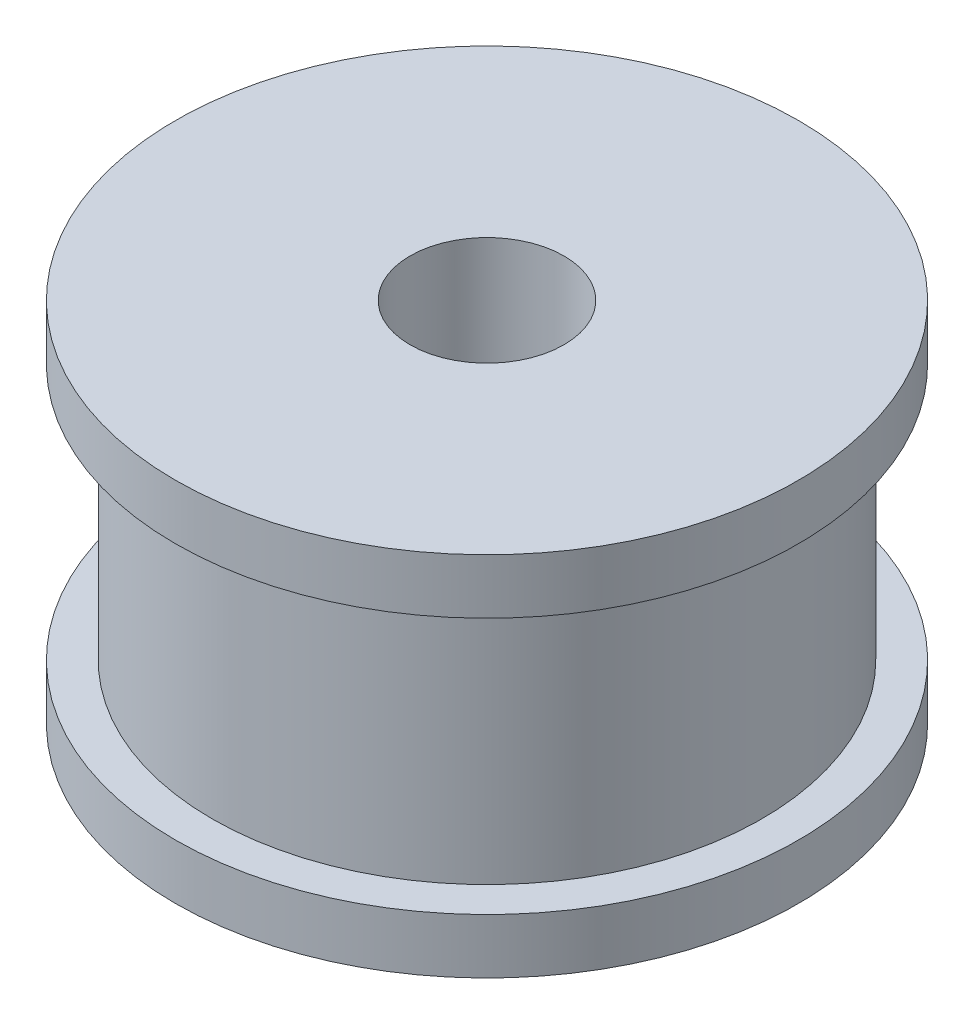
ISO-10303-21;
HEADER;
FILE_DESCRIPTION(('STEP AP214'),'2;1');
FILE_NAME('part.step','',(''),(''),'','','');
FILE_SCHEMA(('AUTOMOTIVE_DESIGN { 1 0 10303 214 1 1 1 1 }'));
ENDSEC;
DATA;
#1=APPLICATION_CONTEXT('core data for automotive mechanical design processes');
#2=APPLICATION_PROTOCOL_DEFINITION('international standard','automotive_design',2000,#1);
#3=PRODUCT_CONTEXT('',#1,'mechanical');
#4=PRODUCT('Part','Part','',(#3));
#5=PRODUCT_RELATED_PRODUCT_CATEGORY('part','',(#4));
#6=PRODUCT_DEFINITION_FORMATION('','',#4);
#7=PRODUCT_DEFINITION_CONTEXT('part definition',#1,'design');
#8=PRODUCT_DEFINITION('design','',#6,#7);
#9=PRODUCT_DEFINITION_SHAPE('','',#8);
#10=(LENGTH_UNIT() NAMED_UNIT(*) SI_UNIT(.MILLI.,.METRE.));
#11=(NAMED_UNIT(*) PLANE_ANGLE_UNIT() SI_UNIT($,.RADIAN.));
#12=(NAMED_UNIT(*) SI_UNIT($,.STERADIAN.) SOLID_ANGLE_UNIT());
#13=UNCERTAINTY_MEASURE_WITH_UNIT(LENGTH_MEASURE(1.E-05),#10,'distance_accuracy_value','');
#14=(GEOMETRIC_REPRESENTATION_CONTEXT(3) GLOBAL_UNCERTAINTY_ASSIGNED_CONTEXT((#13)) GLOBAL_UNIT_ASSIGNED_CONTEXT((#10,
#11,#12)) REPRESENTATION_CONTEXT('',''));
#15=CARTESIAN_POINT('',(0.,0.,0.));
#16=DIRECTION('',(0.,0.,1.));
#17=DIRECTION('',(1.,0.,0.));
#18=AXIS2_PLACEMENT_3D('',#15,#16,#17);
#19=CARTESIAN_POINT('',(0.,7.,0.));
#20=DIRECTION('',(0.,-1.,0.));
#21=DIRECTION('',(0.,0.,-1.));
#22=AXIS2_PLACEMENT_3D('',#19,#20,#21);
#23=CYLINDRICAL_SURFACE('',#22,7.5);
#24=CARTESIAN_POINT('',(0.,7.,0.));
#25=DIRECTION('',(0.,1.,0.));
#26=DIRECTION('',(0.,0.,1.));
#27=AXIS2_PLACEMENT_3D('',#24,#25,#26);
#28=CIRCLE('',#27,7.5);
#29=CARTESIAN_POINT('',(0.,7.,7.5));
#30=VERTEX_POINT('',#29);
#31=EDGE_CURVE('E10',#30,#30,#28,.T.);
#32=ORIENTED_EDGE('',*,*,#31,.F.);
#33=EDGE_LOOP('',(#32));
#34=FACE_BOUND('',#33,.T.);
#35=CARTESIAN_POINT('',(0.,0.,0.));
#36=DIRECTION('',(0.,1.,0.));
#37=DIRECTION('',(0.,0.,1.));
#38=AXIS2_PLACEMENT_3D('',#35,#36,#37);
#39=CIRCLE('',#38,7.5);
#40=CARTESIAN_POINT('',(0.,0.,7.5));
#41=VERTEX_POINT('',#40);
#42=EDGE_CURVE('E36',#41,#41,#39,.T.);
#43=ORIENTED_EDGE('',*,*,#42,.T.);
#44=EDGE_LOOP('',(#43));
#45=FACE_BOUND('',#44,.T.);
#46=ADVANCED_FACE('F33',(#34,#45),#23,.T.);
#47=CARTESIAN_POINT('',(0.,7.,0.));
#48=DIRECTION('',(0.,-1.,0.));
#49=DIRECTION('',(0.,0.,-1.));
#50=AXIS2_PLACEMENT_3D('',#47,#48,#49);
#51=CYLINDRICAL_SURFACE('',#50,2.1);
#52=CARTESIAN_POINT('',(0.,8.5,0.));
#53=DIRECTION('',(0.,1.,0.));
#54=DIRECTION('',(0.,0.,1.));
#55=AXIS2_PLACEMENT_3D('',#52,#53,#54);
#56=CIRCLE('',#55,2.1);
#57=CARTESIAN_POINT('',(0.,8.5,2.1));
#58=VERTEX_POINT('',#57);
#59=EDGE_CURVE('E48',#58,#58,#56,.T.);
#60=ORIENTED_EDGE('',*,*,#59,.T.);
#61=EDGE_LOOP('',(#60));
#62=FACE_BOUND('',#61,.T.);
#63=CARTESIAN_POINT('',(0.,-1.5,0.));
#64=DIRECTION('',(0.,-1.,0.));
#65=DIRECTION('',(0.,0.,-1.));
#66=AXIS2_PLACEMENT_3D('',#63,#64,#65);
#67=CIRCLE('',#66,2.1);
#68=CARTESIAN_POINT('',(0.,-1.5,-2.1));
#69=VERTEX_POINT('',#68);
#70=EDGE_CURVE('E56',#69,#69,#67,.T.);
#71=ORIENTED_EDGE('',*,*,#70,.T.);
#72=EDGE_LOOP('',(#71));
#73=FACE_BOUND('',#72,.T.);
#74=ADVANCED_FACE('F62',(#62,#73),#51,.F.);
#75=CARTESIAN_POINT('',(0.,8.5,0.));
#76=DIRECTION('',(0.,1.,0.));
#77=DIRECTION('',(0.,0.,1.));
#78=AXIS2_PLACEMENT_3D('',#75,#76,#77);
#79=PLANE('',#78);
#80=CARTESIAN_POINT('',(0.,8.5,0.));
#81=DIRECTION('',(0.,1.,0.));
#82=DIRECTION('',(0.,0.,1.));
#83=AXIS2_PLACEMENT_3D('',#80,#81,#82);
#84=CIRCLE('',#83,8.5);
#85=CARTESIAN_POINT('',(0.,8.5,8.5));
#86=VERTEX_POINT('',#85);
#87=EDGE_CURVE('E40',#86,#86,#84,.T.);
#88=ORIENTED_EDGE('',*,*,#87,.T.);
#89=EDGE_LOOP('',(#88));
#90=FACE_BOUND('',#89,.T.);
#91=ORIENTED_EDGE('',*,*,#59,.F.);
#92=EDGE_LOOP('',(#91));
#93=FACE_BOUND('',#92,.T.);
#94=ADVANCED_FACE('F85',(#90,#93),#79,.T.);
#95=CARTESIAN_POINT('',(0.,7.,0.));
#96=DIRECTION('',(0.,1.,0.));
#97=DIRECTION('',(0.,0.,1.));
#98=AXIS2_PLACEMENT_3D('',#95,#96,#97);
#99=PLANE('',#98);
#100=ORIENTED_EDGE('',*,*,#31,.T.);
#101=EDGE_LOOP('',(#100));
#102=FACE_BOUND('',#101,.T.);
#103=CARTESIAN_POINT('',(0.,7.,0.));
#104=DIRECTION('',(0.,1.,0.));
#105=DIRECTION('',(0.,0.,1.));
#106=AXIS2_PLACEMENT_3D('',#103,#104,#105);
#107=CIRCLE('',#106,8.5);
#108=CARTESIAN_POINT('',(0.,7.,8.5));
#109=VERTEX_POINT('',#108);
#110=EDGE_CURVE('E44',#109,#109,#107,.T.);
#111=ORIENTED_EDGE('',*,*,#110,.F.);
#112=EDGE_LOOP('',(#111));
#113=FACE_BOUND('',#112,.T.);
#114=ADVANCED_FACE('F77',(#102,#113),#99,.F.);
#115=CARTESIAN_POINT('',(0.,8.5,0.));
#116=DIRECTION('',(0.,-1.,0.));
#117=DIRECTION('',(0.,0.,-1.));
#118=AXIS2_PLACEMENT_3D('',#115,#116,#117);
#119=CYLINDRICAL_SURFACE('',#118,8.5);
#120=ORIENTED_EDGE('',*,*,#87,.F.);
#121=EDGE_LOOP('',(#120));
#122=FACE_BOUND('',#121,.T.);
#123=ORIENTED_EDGE('',*,*,#110,.T.);
#124=EDGE_LOOP('',(#123));
#125=FACE_BOUND('',#124,.T.);
#126=ADVANCED_FACE('F67',(#122,#125),#119,.T.);
#127=CARTESIAN_POINT('',(0.,-1.5,0.));
#128=DIRECTION('',(0.,-1.,0.));
#129=DIRECTION('',(0.,0.,-1.));
#130=AXIS2_PLACEMENT_3D('',#127,#128,#129);
#131=PLANE('',#130);
#132=CARTESIAN_POINT('',(0.,-1.5,0.));
#133=DIRECTION('',(0.,-1.,0.));
#134=DIRECTION('',(0.,0.,-1.));
#135=AXIS2_PLACEMENT_3D('',#132,#133,#134);
#136=CIRCLE('',#135,8.5);
#137=CARTESIAN_POINT('',(0.,-1.5,-8.5));
#138=VERTEX_POINT('',#137);
#139=EDGE_CURVE('E55',#138,#138,#136,.T.);
#140=ORIENTED_EDGE('',*,*,#139,.T.);
#141=EDGE_LOOP('',(#140));
#142=FACE_BOUND('',#141,.T.);
#143=ORIENTED_EDGE('',*,*,#70,.F.);
#144=EDGE_LOOP('',(#143));
#145=FACE_BOUND('',#144,.T.);
#146=ADVANCED_FACE('F64',(#142,#145),#131,.T.);
#147=CARTESIAN_POINT('',(0.,0.,0.));
#148=DIRECTION('',(0.,-1.,0.));
#149=DIRECTION('',(0.,0.,-1.));
#150=AXIS2_PLACEMENT_3D('',#147,#148,#149);
#151=PLANE('',#150);
#152=ORIENTED_EDGE('',*,*,#42,.F.);
#153=EDGE_LOOP('',(#152));
#154=FACE_BOUND('',#153,.T.);
#155=CARTESIAN_POINT('',(0.,0.,0.));
#156=DIRECTION('',(0.,-1.,0.));
#157=DIRECTION('',(0.,0.,-1.));
#158=AXIS2_PLACEMENT_3D('',#155,#156,#157);
#159=CIRCLE('',#158,8.5);
#160=CARTESIAN_POINT('',(0.,0.,-8.5));
#161=VERTEX_POINT('',#160);
#162=EDGE_CURVE('E52',#161,#161,#159,.T.);
#163=ORIENTED_EDGE('',*,*,#162,.F.);
#164=EDGE_LOOP('',(#163));
#165=FACE_BOUND('',#164,.T.);
#166=ADVANCED_FACE('F66',(#154,#165),#151,.F.);
#167=CARTESIAN_POINT('',(0.,-1.5,0.));
#168=DIRECTION('',(0.,1.,0.));
#169=DIRECTION('',(0.,0.,1.));
#170=AXIS2_PLACEMENT_3D('',#167,#168,#169);
#171=CYLINDRICAL_SURFACE('',#170,8.5);
#172=ORIENTED_EDGE('',*,*,#139,.F.);
#173=EDGE_LOOP('',(#172));
#174=FACE_BOUND('',#173,.T.);
#175=ORIENTED_EDGE('',*,*,#162,.T.);
#176=EDGE_LOOP('',(#175));
#177=FACE_BOUND('',#176,.T.);
#178=ADVANCED_FACE('F74',(#174,#177),#171,.T.);
#179=CLOSED_SHELL('',(#46,#74,#94,#114,#126,#146,#166,#178));
#180=MANIFOLD_SOLID_BREP('B2',#179);
#181=ADVANCED_BREP_SHAPE_REPRESENTATION('',(#18,#180),#14);
#182=SHAPE_DEFINITION_REPRESENTATION(#9,#181);
ENDSEC;
END-ISO-10303-21;
